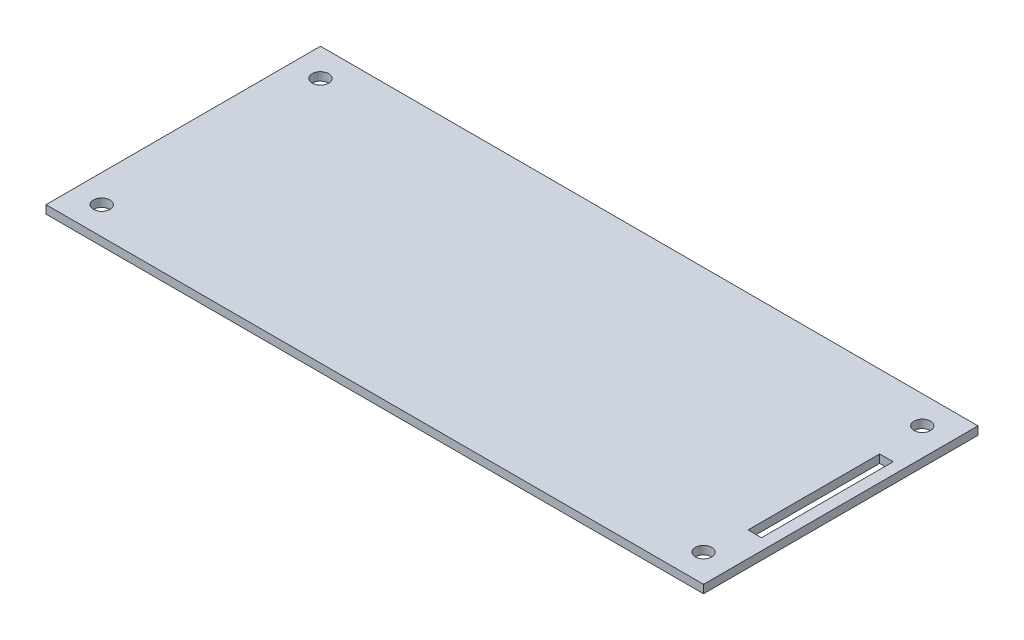
ISO-10303-21;
HEADER;
FILE_DESCRIPTION(('STEP AP214'),'2;1');
FILE_NAME('part.step','',(''),(''),'','','');
FILE_SCHEMA(('AUTOMOTIVE_DESIGN { 1 0 10303 214 1 1 1 1 }'));
ENDSEC;
DATA;
#1=APPLICATION_CONTEXT('core data for automotive mechanical design processes');
#2=APPLICATION_PROTOCOL_DEFINITION('international standard','automotive_design',2000,#1);
#3=PRODUCT_CONTEXT('',#1,'mechanical');
#4=PRODUCT('Part','Part','',(#3));
#5=PRODUCT_RELATED_PRODUCT_CATEGORY('part','',(#4));
#6=PRODUCT_DEFINITION_FORMATION('','',#4);
#7=PRODUCT_DEFINITION_CONTEXT('part definition',#1,'design');
#8=PRODUCT_DEFINITION('design','',#6,#7);
#9=PRODUCT_DEFINITION_SHAPE('','',#8);
#10=(LENGTH_UNIT() NAMED_UNIT(*) SI_UNIT(.MILLI.,.METRE.));
#11=(NAMED_UNIT(*) PLANE_ANGLE_UNIT() SI_UNIT($,.RADIAN.));
#12=(NAMED_UNIT(*) SI_UNIT($,.STERADIAN.) SOLID_ANGLE_UNIT());
#13=UNCERTAINTY_MEASURE_WITH_UNIT(LENGTH_MEASURE(1.E-05),#10,'distance_accuracy_value','');
#14=(GEOMETRIC_REPRESENTATION_CONTEXT(3) GLOBAL_UNCERTAINTY_ASSIGNED_CONTEXT((#13)) GLOBAL_UNIT_ASSIGNED_CONTEXT((#10,
#11,#12)) REPRESENTATION_CONTEXT('',''));
#15=CARTESIAN_POINT('',(0.,0.,0.));
#16=DIRECTION('',(0.,0.,1.));
#17=DIRECTION('',(1.,0.,0.));
#18=AXIS2_PLACEMENT_3D('',#15,#16,#17);
#19=CARTESIAN_POINT('',(0.,1.5,0.));
#20=DIRECTION('',(0.,1.,0.));
#21=DIRECTION('',(0.,0.,1.));
#22=AXIS2_PLACEMENT_3D('',#19,#20,#21);
#23=PLANE('',#22);
#24=DIRECTION('',(1.,0.,0.));
#25=VECTOR('',#24,1.);
#26=CARTESIAN_POINT('',(115.356,1.5,37.4));
#27=LINE('',#26,#25);
#28=CARTESIAN_POINT('',(115.356,1.5,37.4));
#29=VERTEX_POINT('',#28);
#30=CARTESIAN_POINT('',(117.816,1.5,37.4));
#31=VERTEX_POINT('',#30);
#32=EDGE_CURVE('E114',#29,#31,#27,.T.);
#33=ORIENTED_EDGE('',*,*,#32,.F.);
#34=DIRECTION('',(0.,0.,1.));
#35=VECTOR('',#34,1.);
#36=CARTESIAN_POINT('',(115.356,1.5,13.4));
#37=LINE('',#36,#35);
#38=CARTESIAN_POINT('',(115.356,1.5,13.4));
#39=VERTEX_POINT('',#38);
#40=EDGE_CURVE('E105',#39,#29,#37,.T.);
#41=ORIENTED_EDGE('',*,*,#40,.F.);
#42=DIRECTION('',(-1.,0.,0.));
#43=VECTOR('',#42,1.);
#44=CARTESIAN_POINT('',(115.356,1.5,13.4));
#45=LINE('',#44,#43);
#46=CARTESIAN_POINT('',(117.816,1.5,13.4));
#47=VERTEX_POINT('',#46);
#48=EDGE_CURVE('E132',#47,#39,#45,.T.);
#49=ORIENTED_EDGE('',*,*,#48,.F.);
#50=DIRECTION('',(0.,0.,-1.));
#51=VECTOR('',#50,1.);
#52=CARTESIAN_POINT('',(117.816,1.5,13.4));
#53=LINE('',#52,#51);
#54=EDGE_CURVE('E128',#31,#47,#53,.T.);
#55=ORIENTED_EDGE('',*,*,#54,.F.);
#56=EDGE_LOOP('',(#33,#41,#49,#55));
#57=FACE_BOUND('',#56,.T.);
#58=CARTESIAN_POINT('',(5.08,1.5,44.958));
#59=DIRECTION('',(0.,1.,0.));
#60=DIRECTION('',(0.,0.,1.));
#61=AXIS2_PLACEMENT_3D('',#58,#59,#60);
#62=CIRCLE('',#61,1.5);
#63=CARTESIAN_POINT('',(5.08,1.5,46.458));
#64=VERTEX_POINT('',#63);
#65=EDGE_CURVE('E156',#64,#64,#62,.T.);
#66=ORIENTED_EDGE('',*,*,#65,.F.);
#67=EDGE_LOOP('',(#66));
#68=FACE_BOUND('',#67,.T.);
#69=CARTESIAN_POINT('',(5.08,1.5,5.08));
#70=DIRECTION('',(0.,1.,0.));
#71=DIRECTION('',(0.,0.,1.));
#72=AXIS2_PLACEMENT_3D('',#69,#70,#71);
#73=CIRCLE('',#72,1.5);
#74=CARTESIAN_POINT('',(5.08,1.5,6.58));
#75=VERTEX_POINT('',#74);
#76=EDGE_CURVE('E172',#75,#75,#73,.T.);
#77=ORIENTED_EDGE('',*,*,#76,.F.);
#78=EDGE_LOOP('',(#77));
#79=FACE_BOUND('',#78,.T.);
#80=DIRECTION('',(0.,0.,1.));
#81=VECTOR('',#80,1.);
#82=CARTESIAN_POINT('',(0.,1.5,0.));
#83=LINE('',#82,#81);
#84=CARTESIAN_POINT('',(0.,1.5,0.));
#85=VERTEX_POINT('',#84);
#86=CARTESIAN_POINT('',(0.,1.5,50.038));
#87=VERTEX_POINT('',#86);
#88=EDGE_CURVE('E180',#85,#87,#83,.T.);
#89=ORIENTED_EDGE('',*,*,#88,.T.);
#90=DIRECTION('',(1.,0.,0.));
#91=VECTOR('',#90,1.);
#92=CARTESIAN_POINT('',(0.,1.5,50.038));
#93=LINE('',#92,#91);
#94=CARTESIAN_POINT('',(119.888,1.5,50.038));
#95=VERTEX_POINT('',#94);
#96=EDGE_CURVE('E184',#87,#95,#93,.T.);
#97=ORIENTED_EDGE('',*,*,#96,.T.);
#98=DIRECTION('',(0.,0.,-1.));
#99=VECTOR('',#98,1.);
#100=CARTESIAN_POINT('',(119.888,1.5,0.));
#101=LINE('',#100,#99);
#102=CARTESIAN_POINT('',(119.888,1.5,0.));
#103=VERTEX_POINT('',#102);
#104=EDGE_CURVE('E188',#95,#103,#101,.T.);
#105=ORIENTED_EDGE('',*,*,#104,.T.);
#106=DIRECTION('',(-1.,0.,0.));
#107=VECTOR('',#106,1.);
#108=CARTESIAN_POINT('',(0.,1.5,0.));
#109=LINE('',#108,#107);
#110=EDGE_CURVE('E191',#103,#85,#109,.T.);
#111=ORIENTED_EDGE('',*,*,#110,.T.);
#112=EDGE_LOOP('',(#89,#97,#105,#111));
#113=FACE_BOUND('',#112,.T.);
#114=CARTESIAN_POINT('',(114.808,1.5,5.08));
#115=DIRECTION('',(0.,1.,0.));
#116=DIRECTION('',(0.,0.,1.));
#117=AXIS2_PLACEMENT_3D('',#114,#115,#116);
#118=CIRCLE('',#117,1.5);
#119=CARTESIAN_POINT('',(114.808,1.5,6.58));
#120=VERTEX_POINT('',#119);
#121=EDGE_CURVE('E164',#120,#120,#118,.T.);
#122=ORIENTED_EDGE('',*,*,#121,.F.);
#123=EDGE_LOOP('',(#122));
#124=FACE_BOUND('',#123,.T.);
#125=CARTESIAN_POINT('',(114.808,1.5,44.958));
#126=DIRECTION('',(0.,1.,0.));
#127=DIRECTION('',(0.,0.,1.));
#128=AXIS2_PLACEMENT_3D('',#125,#126,#127);
#129=CIRCLE('',#128,1.5);
#130=CARTESIAN_POINT('',(114.808,1.5,46.458));
#131=VERTEX_POINT('',#130);
#132=EDGE_CURVE('E140',#131,#131,#129,.T.);
#133=ORIENTED_EDGE('',*,*,#132,.F.);
#134=EDGE_LOOP('',(#133));
#135=FACE_BOUND('',#134,.T.);
#136=ADVANCED_FACE('F39',(#57,#68,#79,#113,#124,#135),#23,.T.);
#137=CARTESIAN_POINT('',(0.,0.,0.));
#138=DIRECTION('',(0.,1.,0.));
#139=DIRECTION('',(0.,0.,1.));
#140=AXIS2_PLACEMENT_3D('',#137,#138,#139);
#141=PLANE('',#140);
#142=CARTESIAN_POINT('',(5.08,0.,44.958));
#143=DIRECTION('',(0.,1.,0.));
#144=DIRECTION('',(0.,0.,1.));
#145=AXIS2_PLACEMENT_3D('',#142,#143,#144);
#146=CIRCLE('',#145,1.5);
#147=CARTESIAN_POINT('',(5.08,0.,46.458));
#148=VERTEX_POINT('',#147);
#149=EDGE_CURVE('E123',#148,#148,#146,.T.);
#150=ORIENTED_EDGE('',*,*,#149,.T.);
#151=EDGE_LOOP('',(#150));
#152=FACE_BOUND('',#151,.T.);
#153=CARTESIAN_POINT('',(114.808,0.,5.08));
#154=DIRECTION('',(0.,1.,0.));
#155=DIRECTION('',(0.,0.,1.));
#156=AXIS2_PLACEMENT_3D('',#153,#154,#155);
#157=CIRCLE('',#156,1.5);
#158=CARTESIAN_POINT('',(114.808,0.,6.58));
#159=VERTEX_POINT('',#158);
#160=EDGE_CURVE('E160',#159,#159,#157,.T.);
#161=ORIENTED_EDGE('',*,*,#160,.T.);
#162=EDGE_LOOP('',(#161));
#163=FACE_BOUND('',#162,.T.);
#164=CARTESIAN_POINT('',(5.08,0.,5.08));
#165=DIRECTION('',(0.,1.,0.));
#166=DIRECTION('',(0.,0.,1.));
#167=AXIS2_PLACEMENT_3D('',#164,#165,#166);
#168=CIRCLE('',#167,1.5);
#169=CARTESIAN_POINT('',(5.08,0.,6.58));
#170=VERTEX_POINT('',#169);
#171=EDGE_CURVE('E168',#170,#170,#168,.T.);
#172=ORIENTED_EDGE('',*,*,#171,.T.);
#173=EDGE_LOOP('',(#172));
#174=FACE_BOUND('',#173,.T.);
#175=DIRECTION('',(0.,0.,1.));
#176=VECTOR('',#175,1.);
#177=CARTESIAN_POINT('',(0.,0.,0.));
#178=LINE('',#177,#176);
#179=CARTESIAN_POINT('',(0.,0.,0.));
#180=VERTEX_POINT('',#179);
#181=CARTESIAN_POINT('',(0.,0.,50.038));
#182=VERTEX_POINT('',#181);
#183=EDGE_CURVE('E176',#180,#182,#178,.T.);
#184=ORIENTED_EDGE('',*,*,#183,.F.);
#185=DIRECTION('',(-1.,0.,0.));
#186=VECTOR('',#185,1.);
#187=CARTESIAN_POINT('',(0.,0.,0.));
#188=LINE('',#187,#186);
#189=CARTESIAN_POINT('',(119.888,0.,0.));
#190=VERTEX_POINT('',#189);
#191=EDGE_CURVE('E185',#190,#180,#188,.T.);
#192=ORIENTED_EDGE('',*,*,#191,.F.);
#193=DIRECTION('',(0.,0.,-1.));
#194=VECTOR('',#193,1.);
#195=CARTESIAN_POINT('',(119.888,0.,0.));
#196=LINE('',#195,#194);
#197=CARTESIAN_POINT('',(119.888,0.,50.038));
#198=VERTEX_POINT('',#197);
#199=EDGE_CURVE('E201',#198,#190,#196,.T.);
#200=ORIENTED_EDGE('',*,*,#199,.F.);
#201=DIRECTION('',(1.,0.,0.));
#202=VECTOR('',#201,1.);
#203=CARTESIAN_POINT('',(0.,0.,50.038));
#204=LINE('',#203,#202);
#205=EDGE_CURVE('E198',#182,#198,#204,.T.);
#206=ORIENTED_EDGE('',*,*,#205,.F.);
#207=EDGE_LOOP('',(#184,#192,#200,#206));
#208=FACE_BOUND('',#207,.T.);
#209=DIRECTION('',(0.,0.,1.));
#210=VECTOR('',#209,1.);
#211=CARTESIAN_POINT('',(115.356,0.,13.4));
#212=LINE('',#211,#210);
#213=CARTESIAN_POINT('',(115.356,0.,13.4));
#214=VERTEX_POINT('',#213);
#215=CARTESIAN_POINT('',(115.356,0.,37.4));
#216=VERTEX_POINT('',#215);
#217=EDGE_CURVE('E63',#214,#216,#212,.T.);
#218=ORIENTED_EDGE('',*,*,#217,.T.);
#219=DIRECTION('',(1.,0.,0.));
#220=VECTOR('',#219,1.);
#221=CARTESIAN_POINT('',(115.356,0.,37.4));
#222=LINE('',#221,#220);
#223=CARTESIAN_POINT('',(117.816,0.,37.4));
#224=VERTEX_POINT('',#223);
#225=EDGE_CURVE('E121',#216,#224,#222,.T.);
#226=ORIENTED_EDGE('',*,*,#225,.T.);
#227=DIRECTION('',(0.,0.,-1.));
#228=VECTOR('',#227,1.);
#229=CARTESIAN_POINT('',(117.816,0.,13.4));
#230=LINE('',#229,#228);
#231=CARTESIAN_POINT('',(117.816,0.,13.4));
#232=VERTEX_POINT('',#231);
#233=EDGE_CURVE('E143',#224,#232,#230,.T.);
#234=ORIENTED_EDGE('',*,*,#233,.T.);
#235=DIRECTION('',(-1.,0.,0.));
#236=VECTOR('',#235,1.);
#237=CARTESIAN_POINT('',(115.356,0.,13.4));
#238=LINE('',#237,#236);
#239=EDGE_CURVE('E115',#232,#214,#238,.T.);
#240=ORIENTED_EDGE('',*,*,#239,.T.);
#241=EDGE_LOOP('',(#218,#226,#234,#240));
#242=FACE_BOUND('',#241,.T.);
#243=CARTESIAN_POINT('',(114.808,0.,44.958));
#244=DIRECTION('',(0.,1.,0.));
#245=DIRECTION('',(0.,0.,1.));
#246=AXIS2_PLACEMENT_3D('',#243,#244,#245);
#247=CIRCLE('',#246,1.5);
#248=CARTESIAN_POINT('',(114.808,0.,46.458));
#249=VERTEX_POINT('',#248);
#250=EDGE_CURVE('E297',#249,#249,#247,.T.);
#251=ORIENTED_EDGE('',*,*,#250,.T.);
#252=EDGE_LOOP('',(#251));
#253=FACE_BOUND('',#252,.T.);
#254=ADVANCED_FACE('F224',(#152,#163,#174,#208,#242,#253),#141,.F.);
#255=CARTESIAN_POINT('',(0.,1.5,0.));
#256=DIRECTION('',(1.,0.,0.));
#257=DIRECTION('',(0.,0.,-1.));
#258=AXIS2_PLACEMENT_3D('',#255,#256,#257);
#259=PLANE('',#258);
#260=ORIENTED_EDGE('',*,*,#183,.T.);
#261=DIRECTION('',(0.,-1.,0.));
#262=VECTOR('',#261,1.);
#263=CARTESIAN_POINT('',(0.,1.5,50.038));
#264=LINE('',#263,#262);
#265=EDGE_CURVE('E11',#87,#182,#264,.T.);
#266=ORIENTED_EDGE('',*,*,#265,.F.);
#267=ORIENTED_EDGE('',*,*,#88,.F.);
#268=DIRECTION('',(0.,-1.,0.));
#269=VECTOR('',#268,1.);
#270=CARTESIAN_POINT('',(0.,1.5,0.));
#271=LINE('',#270,#269);
#272=EDGE_CURVE('E194',#85,#180,#271,.T.);
#273=ORIENTED_EDGE('',*,*,#272,.T.);
#274=EDGE_LOOP('',(#260,#266,#267,#273));
#275=FACE_BOUND('',#274,.T.);
#276=ADVANCED_FACE('F41',(#275),#259,.F.);
#277=CARTESIAN_POINT('',(0.,1.5,50.038));
#278=DIRECTION('',(0.,0.,-1.));
#279=DIRECTION('',(-1.,0.,0.));
#280=AXIS2_PLACEMENT_3D('',#277,#278,#279);
#281=PLANE('',#280);
#282=ORIENTED_EDGE('',*,*,#205,.T.);
#283=DIRECTION('',(0.,-1.,0.));
#284=VECTOR('',#283,1.);
#285=CARTESIAN_POINT('',(119.888,1.5,50.038));
#286=LINE('',#285,#284);
#287=EDGE_CURVE('E48',#95,#198,#286,.T.);
#288=ORIENTED_EDGE('',*,*,#287,.F.);
#289=ORIENTED_EDGE('',*,*,#96,.F.);
#290=ORIENTED_EDGE('',*,*,#265,.T.);
#291=EDGE_LOOP('',(#282,#288,#289,#290));
#292=FACE_BOUND('',#291,.T.);
#293=ADVANCED_FACE('F235',(#292),#281,.F.);
#294=CARTESIAN_POINT('',(119.888,1.5,0.));
#295=DIRECTION('',(-1.,0.,0.));
#296=DIRECTION('',(0.,0.,1.));
#297=AXIS2_PLACEMENT_3D('',#294,#295,#296);
#298=PLANE('',#297);
#299=ORIENTED_EDGE('',*,*,#199,.T.);
#300=DIRECTION('',(0.,-1.,0.));
#301=VECTOR('',#300,1.);
#302=CARTESIAN_POINT('',(119.888,1.5,0.));
#303=LINE('',#302,#301);
#304=EDGE_CURVE('E209',#103,#190,#303,.T.);
#305=ORIENTED_EDGE('',*,*,#304,.F.);
#306=ORIENTED_EDGE('',*,*,#104,.F.);
#307=ORIENTED_EDGE('',*,*,#287,.T.);
#308=EDGE_LOOP('',(#299,#305,#306,#307));
#309=FACE_BOUND('',#308,.T.);
#310=ADVANCED_FACE('F218',(#309),#298,.F.);
#311=CARTESIAN_POINT('',(0.,1.5,0.));
#312=DIRECTION('',(0.,0.,1.));
#313=DIRECTION('',(1.,0.,0.));
#314=AXIS2_PLACEMENT_3D('',#311,#312,#313);
#315=PLANE('',#314);
#316=ORIENTED_EDGE('',*,*,#191,.T.);
#317=ORIENTED_EDGE('',*,*,#272,.F.);
#318=ORIENTED_EDGE('',*,*,#110,.F.);
#319=ORIENTED_EDGE('',*,*,#304,.T.);
#320=EDGE_LOOP('',(#316,#317,#318,#319));
#321=FACE_BOUND('',#320,.T.);
#322=ADVANCED_FACE('F228',(#321),#315,.F.);
#323=CARTESIAN_POINT('',(5.08,1.5,5.08));
#324=DIRECTION('',(0.,-1.,0.));
#325=DIRECTION('',(0.,0.,-1.));
#326=AXIS2_PLACEMENT_3D('',#323,#324,#325);
#327=CYLINDRICAL_SURFACE('',#326,1.5);
#328=ORIENTED_EDGE('',*,*,#76,.T.);
#329=EDGE_LOOP('',(#328));
#330=FACE_BOUND('',#329,.T.);
#331=ORIENTED_EDGE('',*,*,#171,.F.);
#332=EDGE_LOOP('',(#331));
#333=FACE_BOUND('',#332,.T.);
#334=ADVANCED_FACE('F250',(#330,#333),#327,.F.);
#335=CARTESIAN_POINT('',(114.808,1.5,5.08));
#336=DIRECTION('',(0.,-1.,0.));
#337=DIRECTION('',(0.,0.,-1.));
#338=AXIS2_PLACEMENT_3D('',#335,#336,#337);
#339=CYLINDRICAL_SURFACE('',#338,1.5);
#340=ORIENTED_EDGE('',*,*,#121,.T.);
#341=EDGE_LOOP('',(#340));
#342=FACE_BOUND('',#341,.T.);
#343=ORIENTED_EDGE('',*,*,#160,.F.);
#344=EDGE_LOOP('',(#343));
#345=FACE_BOUND('',#344,.T.);
#346=ADVANCED_FACE('F257',(#342,#345),#339,.F.);
#347=CARTESIAN_POINT('',(5.08,1.5,44.958));
#348=DIRECTION('',(0.,-1.,0.));
#349=DIRECTION('',(0.,0.,-1.));
#350=AXIS2_PLACEMENT_3D('',#347,#348,#349);
#351=CYLINDRICAL_SURFACE('',#350,1.5);
#352=ORIENTED_EDGE('',*,*,#65,.T.);
#353=EDGE_LOOP('',(#352));
#354=FACE_BOUND('',#353,.T.);
#355=ORIENTED_EDGE('',*,*,#149,.F.);
#356=EDGE_LOOP('',(#355));
#357=FACE_BOUND('',#356,.T.);
#358=ADVANCED_FACE('F262',(#354,#357),#351,.F.);
#359=CARTESIAN_POINT('',(115.356,1.5,13.4));
#360=DIRECTION('',(1.,0.,0.));
#361=DIRECTION('',(0.,0.,-1.));
#362=AXIS2_PLACEMENT_3D('',#359,#360,#361);
#363=PLANE('',#362);
#364=ORIENTED_EDGE('',*,*,#217,.F.);
#365=DIRECTION('',(0.,-1.,0.));
#366=VECTOR('',#365,1.);
#367=CARTESIAN_POINT('',(115.356,1.5,13.4));
#368=LINE('',#367,#366);
#369=EDGE_CURVE('E109',#39,#214,#368,.T.);
#370=ORIENTED_EDGE('',*,*,#369,.F.);
#371=ORIENTED_EDGE('',*,*,#40,.T.);
#372=DIRECTION('',(0.,-1.,0.));
#373=VECTOR('',#372,1.);
#374=CARTESIAN_POINT('',(115.356,1.5,37.4));
#375=LINE('',#374,#373);
#376=EDGE_CURVE('E108',#29,#216,#375,.T.);
#377=ORIENTED_EDGE('',*,*,#376,.T.);
#378=EDGE_LOOP('',(#364,#370,#371,#377));
#379=FACE_BOUND('',#378,.T.);
#380=ADVANCED_FACE('F107',(#379),#363,.T.);
#381=CARTESIAN_POINT('',(115.356,1.5,37.4));
#382=DIRECTION('',(0.,0.,-1.));
#383=DIRECTION('',(-1.,0.,0.));
#384=AXIS2_PLACEMENT_3D('',#381,#382,#383);
#385=PLANE('',#384);
#386=ORIENTED_EDGE('',*,*,#225,.F.);
#387=ORIENTED_EDGE('',*,*,#376,.F.);
#388=ORIENTED_EDGE('',*,*,#32,.T.);
#389=DIRECTION('',(0.,-1.,0.));
#390=VECTOR('',#389,1.);
#391=CARTESIAN_POINT('',(117.816,1.5,37.4));
#392=LINE('',#391,#390);
#393=EDGE_CURVE('E124',#31,#224,#392,.T.);
#394=ORIENTED_EDGE('',*,*,#393,.T.);
#395=EDGE_LOOP('',(#386,#387,#388,#394));
#396=FACE_BOUND('',#395,.T.);
#397=ADVANCED_FACE('F118',(#396),#385,.T.);
#398=CARTESIAN_POINT('',(117.816,1.5,13.4));
#399=DIRECTION('',(-1.,0.,0.));
#400=DIRECTION('',(0.,0.,1.));
#401=AXIS2_PLACEMENT_3D('',#398,#399,#400);
#402=PLANE('',#401);
#403=ORIENTED_EDGE('',*,*,#233,.F.);
#404=ORIENTED_EDGE('',*,*,#393,.F.);
#405=ORIENTED_EDGE('',*,*,#54,.T.);
#406=DIRECTION('',(0.,-1.,0.));
#407=VECTOR('',#406,1.);
#408=CARTESIAN_POINT('',(117.816,1.5,13.4));
#409=LINE('',#408,#407);
#410=EDGE_CURVE('E55',#47,#232,#409,.T.);
#411=ORIENTED_EDGE('',*,*,#410,.T.);
#412=EDGE_LOOP('',(#403,#404,#405,#411));
#413=FACE_BOUND('',#412,.T.);
#414=ADVANCED_FACE('F280',(#413),#402,.T.);
#415=CARTESIAN_POINT('',(115.356,1.5,13.4));
#416=DIRECTION('',(0.,0.,1.));
#417=DIRECTION('',(1.,0.,0.));
#418=AXIS2_PLACEMENT_3D('',#415,#416,#417);
#419=PLANE('',#418);
#420=ORIENTED_EDGE('',*,*,#239,.F.);
#421=ORIENTED_EDGE('',*,*,#410,.F.);
#422=ORIENTED_EDGE('',*,*,#48,.T.);
#423=ORIENTED_EDGE('',*,*,#369,.T.);
#424=EDGE_LOOP('',(#420,#421,#422,#423));
#425=FACE_BOUND('',#424,.T.);
#426=ADVANCED_FACE('F283',(#425),#419,.T.);
#427=CARTESIAN_POINT('',(114.808,1.5,44.958));
#428=DIRECTION('',(0.,-1.,0.));
#429=DIRECTION('',(0.,0.,-1.));
#430=AXIS2_PLACEMENT_3D('',#427,#428,#429);
#431=CYLINDRICAL_SURFACE('',#430,1.5);
#432=ORIENTED_EDGE('',*,*,#132,.T.);
#433=EDGE_LOOP('',(#432));
#434=FACE_BOUND('',#433,.T.);
#435=ORIENTED_EDGE('',*,*,#250,.F.);
#436=EDGE_LOOP('',(#435));
#437=FACE_BOUND('',#436,.T.);
#438=ADVANCED_FACE('F287',(#434,#437),#431,.F.);
#439=CLOSED_SHELL('',(#136,#254,#276,#293,#310,#322,#334,#346,#358,#380,#397,#414,#426,#438));
#440=MANIFOLD_SOLID_BREP('B2',#439);
#441=ADVANCED_BREP_SHAPE_REPRESENTATION('',(#18,#440),#14);
#442=SHAPE_DEFINITION_REPRESENTATION(#9,#441);
ENDSEC;
END-ISO-10303-21;
